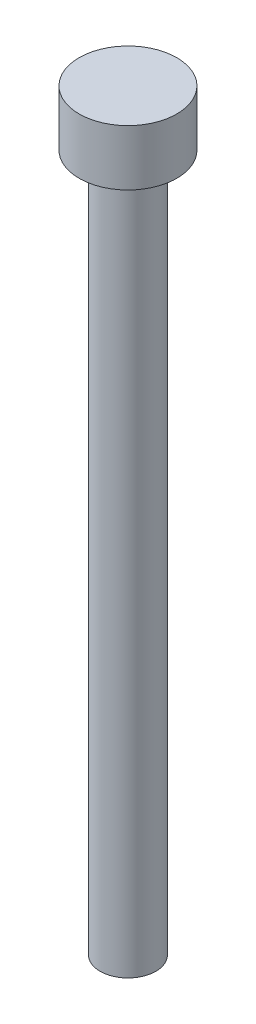
ISO-10303-21;
HEADER;
FILE_DESCRIPTION(('STEP AP214'),'2;1');
FILE_NAME('part.step','',(''),(''),'','','');
FILE_SCHEMA(('AUTOMOTIVE_DESIGN { 1 0 10303 214 1 1 1 1 }'));
ENDSEC;
DATA;
#1=APPLICATION_CONTEXT('core data for automotive mechanical design processes');
#2=APPLICATION_PROTOCOL_DEFINITION('international standard','automotive_design',2000,#1);
#3=PRODUCT_CONTEXT('',#1,'mechanical');
#4=PRODUCT('Part','Part','',(#3));
#5=PRODUCT_RELATED_PRODUCT_CATEGORY('part','',(#4));
#6=PRODUCT_DEFINITION_FORMATION('','',#4);
#7=PRODUCT_DEFINITION_CONTEXT('part definition',#1,'design');
#8=PRODUCT_DEFINITION('design','',#6,#7);
#9=PRODUCT_DEFINITION_SHAPE('','',#8);
#10=(LENGTH_UNIT() NAMED_UNIT(*) SI_UNIT(.MILLI.,.METRE.));
#11=(NAMED_UNIT(*) PLANE_ANGLE_UNIT() SI_UNIT($,.RADIAN.));
#12=(NAMED_UNIT(*) SI_UNIT($,.STERADIAN.) SOLID_ANGLE_UNIT());
#13=UNCERTAINTY_MEASURE_WITH_UNIT(LENGTH_MEASURE(1.E-05),#10,'distance_accuracy_value','');
#14=(GEOMETRIC_REPRESENTATION_CONTEXT(3) GLOBAL_UNCERTAINTY_ASSIGNED_CONTEXT((#13)) GLOBAL_UNIT_ASSIGNED_CONTEXT((#10,
#11,#12)) REPRESENTATION_CONTEXT('',''));
#15=CARTESIAN_POINT('',(0.,0.,0.));
#16=DIRECTION('',(0.,0.,1.));
#17=DIRECTION('',(1.,0.,0.));
#18=AXIS2_PLACEMENT_3D('',#15,#16,#17);
#19=CARTESIAN_POINT('',(0.,54.,0.));
#20=DIRECTION('',(0.,-1.,0.));
#21=DIRECTION('',(1.,0.,0.));
#22=AXIS2_PLACEMENT_3D('',#19,#20,#21);
#23=PLANE('',#22);
#24=CARTESIAN_POINT('',(0.,54.,0.));
#25=DIRECTION('',(0.,1.,0.));
#26=DIRECTION('',(-1.,0.,0.));
#27=AXIS2_PLACEMENT_3D('',#24,#25,#26);
#28=CIRCLE('',#27,3.5);
#29=CARTESIAN_POINT('',(-3.5,54.,0.));
#30=VERTEX_POINT('',#29);
#31=EDGE_CURVE('E10',#30,#30,#28,.T.);
#32=ORIENTED_EDGE('',*,*,#31,.T.);
#33=EDGE_LOOP('',(#32));
#34=FACE_BOUND('',#33,.T.);
#35=ADVANCED_FACE('F31',(#34),#23,.F.);
#36=CARTESIAN_POINT('',(0.,54.,0.));
#37=DIRECTION('',(0.,1.,0.));
#38=DIRECTION('',(-1.,0.,0.));
#39=AXIS2_PLACEMENT_3D('',#36,#37,#38);
#40=CYLINDRICAL_SURFACE('',#39,3.5);
#41=ORIENTED_EDGE('',*,*,#31,.F.);
#42=EDGE_LOOP('',(#41));
#43=FACE_BOUND('',#42,.T.);
#44=CARTESIAN_POINT('',(0.,50.,0.));
#45=DIRECTION('',(0.,1.,0.));
#46=DIRECTION('',(-1.,0.,0.));
#47=AXIS2_PLACEMENT_3D('',#44,#45,#46);
#48=CIRCLE('',#47,3.5);
#49=CARTESIAN_POINT('',(-3.5,50.,0.));
#50=VERTEX_POINT('',#49);
#51=EDGE_CURVE('E37',#50,#50,#48,.T.);
#52=ORIENTED_EDGE('',*,*,#51,.T.);
#53=EDGE_LOOP('',(#52));
#54=FACE_BOUND('',#53,.T.);
#55=ADVANCED_FACE('F63',(#43,#54),#40,.T.);
#56=CARTESIAN_POINT('',(3.5,50.,0.));
#57=DIRECTION('',(0.,1.,0.));
#58=DIRECTION('',(-1.,0.,0.));
#59=AXIS2_PLACEMENT_3D('',#56,#57,#58);
#60=PLANE('',#59);
#61=ORIENTED_EDGE('',*,*,#51,.F.);
#62=EDGE_LOOP('',(#61));
#63=FACE_BOUND('',#62,.T.);
#64=CARTESIAN_POINT('',(0.,50.,0.));
#65=DIRECTION('',(0.,1.,0.));
#66=DIRECTION('',(-1.,0.,0.));
#67=AXIS2_PLACEMENT_3D('',#64,#65,#66);
#68=CIRCLE('',#67,1.99999999999999);
#69=CARTESIAN_POINT('',(-1.99999999999999,50.,0.));
#70=VERTEX_POINT('',#69);
#71=EDGE_CURVE('E41',#70,#70,#68,.T.);
#72=ORIENTED_EDGE('',*,*,#71,.T.);
#73=EDGE_LOOP('',(#72));
#74=FACE_BOUND('',#73,.T.);
#75=ADVANCED_FACE('F59',(#63,#74),#60,.F.);
#76=CARTESIAN_POINT('',(0.,54.,0.));
#77=DIRECTION('',(0.,1.,0.));
#78=DIRECTION('',(-1.,0.,0.));
#79=AXIS2_PLACEMENT_3D('',#76,#77,#78);
#80=CYLINDRICAL_SURFACE('',#79,2.);
#81=ORIENTED_EDGE('',*,*,#71,.F.);
#82=EDGE_LOOP('',(#81));
#83=FACE_BOUND('',#82,.T.);
#84=CARTESIAN_POINT('',(0.,0.,0.));
#85=DIRECTION('',(0.,1.,0.));
#86=DIRECTION('',(-1.,0.,0.));
#87=AXIS2_PLACEMENT_3D('',#84,#85,#86);
#88=CIRCLE('',#87,2.);
#89=CARTESIAN_POINT('',(-2.,0.,0.));
#90=VERTEX_POINT('',#89);
#91=EDGE_CURVE('E45',#90,#90,#88,.T.);
#92=ORIENTED_EDGE('',*,*,#91,.T.);
#93=EDGE_LOOP('',(#92));
#94=FACE_BOUND('',#93,.T.);
#95=ADVANCED_FACE('F51',(#83,#94),#80,.T.);
#96=CARTESIAN_POINT('',(2.,0.,0.));
#97=DIRECTION('',(0.,1.,0.));
#98=DIRECTION('',(-1.,0.,0.));
#99=AXIS2_PLACEMENT_3D('',#96,#97,#98);
#100=PLANE('',#99);
#101=ORIENTED_EDGE('',*,*,#91,.F.);
#102=EDGE_LOOP('',(#101));
#103=FACE_BOUND('',#102,.T.);
#104=ADVANCED_FACE('F53',(#103),#100,.F.);
#105=CLOSED_SHELL('',(#35,#55,#75,#95,#104));
#106=MANIFOLD_SOLID_BREP('B2',#105);
#107=ADVANCED_BREP_SHAPE_REPRESENTATION('',(#18,#106),#14);
#108=SHAPE_DEFINITION_REPRESENTATION(#9,#107);
ENDSEC;
END-ISO-10303-21;
